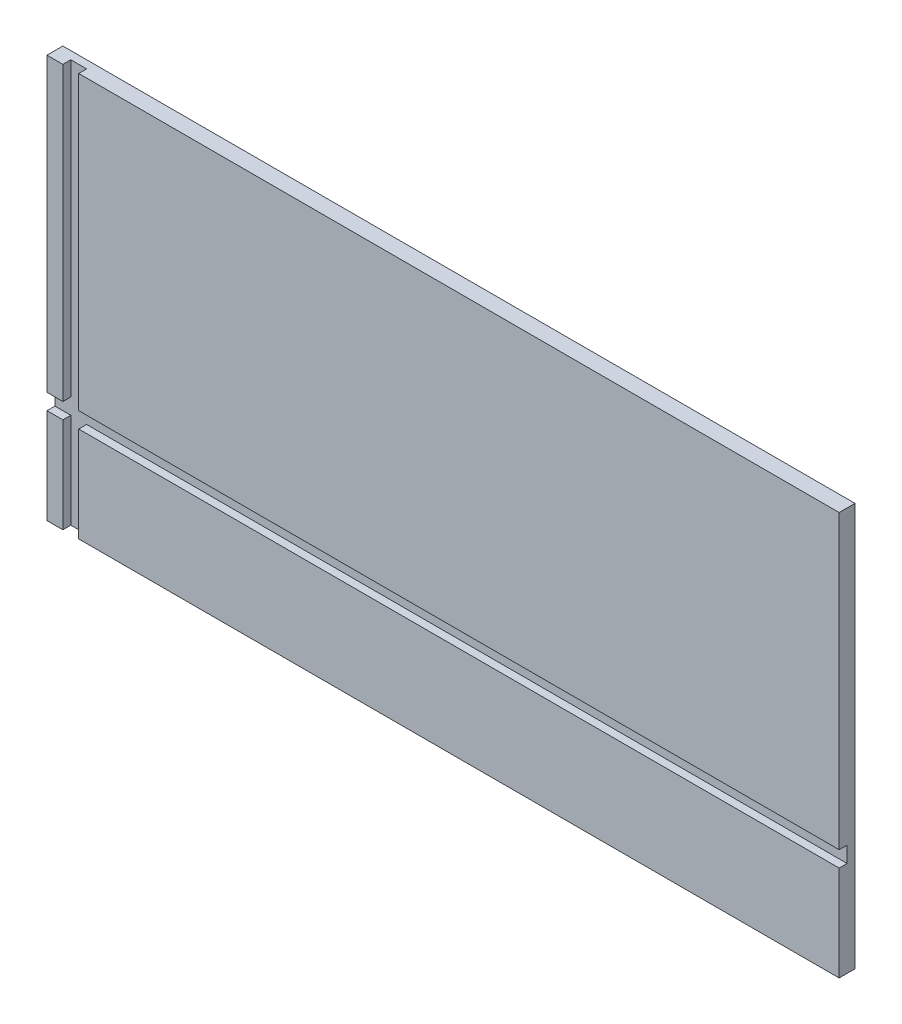
ISO-10303-21;
HEADER;
FILE_DESCRIPTION(('STEP AP214'),'2;1');
FILE_NAME('part.step','',(''),(''),'','','');
FILE_SCHEMA(('AUTOMOTIVE_DESIGN { 1 0 10303 214 1 1 1 1 }'));
ENDSEC;
DATA;
#1=APPLICATION_CONTEXT('core data for automotive mechanical design processes');
#2=APPLICATION_PROTOCOL_DEFINITION('international standard','automotive_design',2000,#1);
#3=PRODUCT_CONTEXT('',#1,'mechanical');
#4=PRODUCT('Part','Part','',(#3));
#5=PRODUCT_RELATED_PRODUCT_CATEGORY('part','',(#4));
#6=PRODUCT_DEFINITION_FORMATION('','',#4);
#7=PRODUCT_DEFINITION_CONTEXT('part definition',#1,'design');
#8=PRODUCT_DEFINITION('design','',#6,#7);
#9=PRODUCT_DEFINITION_SHAPE('','',#8);
#10=(LENGTH_UNIT() NAMED_UNIT(*) SI_UNIT(.MILLI.,.METRE.));
#11=(NAMED_UNIT(*) PLANE_ANGLE_UNIT() SI_UNIT($,.RADIAN.));
#12=(NAMED_UNIT(*) SI_UNIT($,.STERADIAN.) SOLID_ANGLE_UNIT());
#13=UNCERTAINTY_MEASURE_WITH_UNIT(LENGTH_MEASURE(1.E-05),#10,'distance_accuracy_value','');
#14=(GEOMETRIC_REPRESENTATION_CONTEXT(3) GLOBAL_UNCERTAINTY_ASSIGNED_CONTEXT((#13)) GLOBAL_UNIT_ASSIGNED_CONTEXT((#10,
#11,#12)) REPRESENTATION_CONTEXT('',''));
#15=CARTESIAN_POINT('',(0.,0.,0.));
#16=DIRECTION('',(0.,0.,1.));
#17=DIRECTION('',(1.,0.,0.));
#18=AXIS2_PLACEMENT_3D('',#15,#16,#17);
#19=CARTESIAN_POINT('',(0.,0.,3.175));
#20=DIRECTION('',(0.,0.,-1.));
#21=DIRECTION('',(-1.,0.,0.));
#22=AXIS2_PLACEMENT_3D('',#19,#20,#21);
#23=PLANE('',#22);
#24=DIRECTION('',(1.,0.,0.));
#25=VECTOR('',#24,1.);
#26=CARTESIAN_POINT('',(0.,19.05,3.175));
#27=LINE('',#26,#25);
#28=CARTESIAN_POINT('',(-3.17499999999999,19.05,3.175));
#29=VERTEX_POINT('',#28);
#30=CARTESIAN_POINT('',(148.955,19.05,3.175));
#31=VERTEX_POINT('',#30);
#32=EDGE_CURVE('E225',#29,#31,#27,.T.);
#33=ORIENTED_EDGE('',*,*,#32,.F.);
#34=DIRECTION('',(0.,1.,0.));
#35=VECTOR('',#34,1.);
#36=CARTESIAN_POINT('',(-3.17499999999999,0.,3.175));
#37=LINE('',#36,#35);
#38=CARTESIAN_POINT('',(-3.17499999999999,0.,3.175));
#39=VERTEX_POINT('',#38);
#40=EDGE_CURVE('E162',#39,#29,#37,.T.);
#41=ORIENTED_EDGE('',*,*,#40,.F.);
#42=DIRECTION('',(1.,0.,0.));
#43=VECTOR('',#42,1.);
#44=CARTESIAN_POINT('',(89.265,0.,3.175));
#45=LINE('',#44,#43);
#46=CARTESIAN_POINT('',(148.955,0.,3.175));
#47=VERTEX_POINT('',#46);
#48=EDGE_CURVE('E239',#39,#47,#45,.T.);
#49=ORIENTED_EDGE('',*,*,#48,.T.);
#50=DIRECTION('',(0.,1.,0.));
#51=VECTOR('',#50,1.);
#52=CARTESIAN_POINT('',(148.955,80.645,3.175));
#53=LINE('',#52,#51);
#54=EDGE_CURVE('E240',#47,#31,#53,.T.);
#55=ORIENTED_EDGE('',*,*,#54,.T.);
#56=EDGE_LOOP('',(#33,#41,#49,#55));
#57=FACE_BOUND('',#56,.T.);
#58=ADVANCED_FACE('F33',(#57),#23,.F.);
#59=DIRECTION('',(-1.,0.,0.));
#60=VECTOR('',#59,1.);
#61=CARTESIAN_POINT('',(0.,80.645,3.175));
#62=LINE('',#61,#60);
#63=CARTESIAN_POINT('',(148.955,80.645,3.175));
#64=VERTEX_POINT('',#63);
#65=CARTESIAN_POINT('',(-3.17499999999999,80.645,3.175));
#66=VERTEX_POINT('',#65);
#67=EDGE_CURVE('E243',#64,#66,#62,.T.);
#68=ORIENTED_EDGE('',*,*,#67,.T.);
#69=CARTESIAN_POINT('',(-3.17499999999999,22.225,3.175));
#70=VERTEX_POINT('',#69);
#71=EDGE_CURVE('E269',#70,#66,#37,.T.);
#72=ORIENTED_EDGE('',*,*,#71,.F.);
#73=DIRECTION('',(1.,0.,0.));
#74=VECTOR('',#73,1.);
#75=CARTESIAN_POINT('',(0.,22.225,3.175));
#76=LINE('',#75,#74);
#77=CARTESIAN_POINT('',(148.955,22.225,3.175));
#78=VERTEX_POINT('',#77);
#79=EDGE_CURVE('E229',#70,#78,#76,.T.);
#80=ORIENTED_EDGE('',*,*,#79,.T.);
#81=EDGE_CURVE('E238',#78,#64,#53,.T.);
#82=ORIENTED_EDGE('',*,*,#81,.T.);
#83=EDGE_LOOP('',(#68,#72,#80,#82));
#84=FACE_BOUND('',#83,.T.);
#85=ADVANCED_FACE('F300',(#84),#23,.F.);
#86=CARTESIAN_POINT('',(0.,19.05,1.5875));
#87=DIRECTION('',(0.,-1.,0.));
#88=DIRECTION('',(0.,0.,-1.));
#89=AXIS2_PLACEMENT_3D('',#86,#87,#88);
#90=PLANE('',#89);
#91=DIRECTION('',(1.,0.,0.));
#92=VECTOR('',#91,1.);
#93=CARTESIAN_POINT('',(0.,19.05,1.5875));
#94=LINE('',#93,#92);
#95=CARTESIAN_POINT('',(-3.17499999999999,19.05,1.5875));
#96=VERTEX_POINT('',#95);
#97=CARTESIAN_POINT('',(148.955,19.05,1.5875));
#98=VERTEX_POINT('',#97);
#99=EDGE_CURVE('E220',#96,#98,#94,.T.);
#100=ORIENTED_EDGE('',*,*,#99,.F.);
#101=DIRECTION('',(0.,0.,1.));
#102=VECTOR('',#101,1.);
#103=CARTESIAN_POINT('',(-3.17499999999999,19.05,1.5875));
#104=LINE('',#103,#102);
#105=EDGE_CURVE('E184',#96,#29,#104,.T.);
#106=ORIENTED_EDGE('',*,*,#105,.T.);
#107=ORIENTED_EDGE('',*,*,#32,.T.);
#108=DIRECTION('',(0.,0.,-1.));
#109=VECTOR('',#108,1.);
#110=CARTESIAN_POINT('',(148.955,19.05,1.5875));
#111=LINE('',#110,#109);
#112=EDGE_CURVE('E211',#31,#98,#111,.T.);
#113=ORIENTED_EDGE('',*,*,#112,.T.);
#114=EDGE_LOOP('',(#100,#106,#107,#113));
#115=FACE_BOUND('',#114,.T.);
#116=ADVANCED_FACE('F292',(#115),#90,.F.);
#117=CARTESIAN_POINT('',(0.,22.225,3.175));
#118=DIRECTION('',(0.,1.,0.));
#119=DIRECTION('',(0.,0.,1.));
#120=AXIS2_PLACEMENT_3D('',#117,#118,#119);
#121=PLANE('',#120);
#122=ORIENTED_EDGE('',*,*,#79,.F.);
#123=DIRECTION('',(0.,0.,-1.));
#124=VECTOR('',#123,1.);
#125=CARTESIAN_POINT('',(-3.17499999999999,22.225,3.175));
#126=LINE('',#125,#124);
#127=CARTESIAN_POINT('',(-3.17499999999999,22.225,1.5875));
#128=VERTEX_POINT('',#127);
#129=EDGE_CURVE('E181',#70,#128,#126,.T.);
#130=ORIENTED_EDGE('',*,*,#129,.T.);
#131=DIRECTION('',(1.,0.,0.));
#132=VECTOR('',#131,1.);
#133=CARTESIAN_POINT('',(0.,22.225,1.5875));
#134=LINE('',#133,#132);
#135=CARTESIAN_POINT('',(148.955,22.225,1.5875));
#136=VERTEX_POINT('',#135);
#137=EDGE_CURVE('E232',#128,#136,#134,.T.);
#138=ORIENTED_EDGE('',*,*,#137,.T.);
#139=DIRECTION('',(0.,0.,1.));
#140=VECTOR('',#139,1.);
#141=CARTESIAN_POINT('',(148.955,22.225,3.175));
#142=LINE('',#141,#140);
#143=EDGE_CURVE('E217',#136,#78,#142,.T.);
#144=ORIENTED_EDGE('',*,*,#143,.T.);
#145=EDGE_LOOP('',(#122,#130,#138,#144));
#146=FACE_BOUND('',#145,.T.);
#147=ADVANCED_FACE('F295',(#146),#121,.F.);
#148=CARTESIAN_POINT('',(-9.525,0.,3.175));
#149=VERTEX_POINT('',#148);
#150=CARTESIAN_POINT('',(-6.35,0.,3.175));
#151=VERTEX_POINT('',#150);
#152=EDGE_CURVE('E235',#149,#151,#45,.T.);
#153=ORIENTED_EDGE('',*,*,#152,.T.);
#154=DIRECTION('',(0.,-1.,0.));
#155=VECTOR('',#154,1.);
#156=CARTESIAN_POINT('',(-6.35000000000001,80.645,3.175));
#157=LINE('',#156,#155);
#158=CARTESIAN_POINT('',(-6.35,19.05,3.175));
#159=VERTEX_POINT('',#158);
#160=EDGE_CURVE('E270',#159,#151,#157,.T.);
#161=ORIENTED_EDGE('',*,*,#160,.F.);
#162=CARTESIAN_POINT('',(-9.525,19.05,3.175));
#163=VERTEX_POINT('',#162);
#164=EDGE_CURVE('E221',#163,#159,#27,.T.);
#165=ORIENTED_EDGE('',*,*,#164,.F.);
#166=DIRECTION('',(0.,1.,0.));
#167=VECTOR('',#166,1.);
#168=CARTESIAN_POINT('',(-9.525,19.05,3.175));
#169=LINE('',#168,#167);
#170=EDGE_CURVE('E193',#149,#163,#169,.T.);
#171=ORIENTED_EDGE('',*,*,#170,.F.);
#172=EDGE_LOOP('',(#153,#161,#165,#171));
#173=FACE_BOUND('',#172,.T.);
#174=ADVANCED_FACE('F303',(#173),#23,.F.);
#175=CARTESIAN_POINT('',(89.265,0.,3.175));
#176=DIRECTION('',(0.,1.,0.));
#177=DIRECTION('',(0.,0.,1.));
#178=AXIS2_PLACEMENT_3D('',#175,#176,#177);
#179=PLANE('',#178);
#180=ORIENTED_EDGE('',*,*,#48,.F.);
#181=DIRECTION('',(0.,0.,1.));
#182=VECTOR('',#181,1.);
#183=CARTESIAN_POINT('',(-3.17499999999999,0.,1.5875));
#184=LINE('',#183,#182);
#185=CARTESIAN_POINT('',(-3.17499999999999,0.,1.5875));
#186=VERTEX_POINT('',#185);
#187=EDGE_CURVE('E171',#186,#39,#184,.T.);
#188=ORIENTED_EDGE('',*,*,#187,.F.);
#189=DIRECTION('',(1.,0.,0.));
#190=VECTOR('',#189,1.);
#191=CARTESIAN_POINT('',(-6.35,0.,1.5875));
#192=LINE('',#191,#190);
#193=CARTESIAN_POINT('',(-6.35,0.,1.5875));
#194=VERTEX_POINT('',#193);
#195=EDGE_CURVE('E150',#194,#186,#192,.T.);
#196=ORIENTED_EDGE('',*,*,#195,.F.);
#197=DIRECTION('',(0.,0.,1.));
#198=VECTOR('',#197,1.);
#199=CARTESIAN_POINT('',(-6.35,0.,1.5875));
#200=LINE('',#199,#198);
#201=EDGE_CURVE('E168',#194,#151,#200,.T.);
#202=ORIENTED_EDGE('',*,*,#201,.T.);
#203=ORIENTED_EDGE('',*,*,#152,.F.);
#204=DIRECTION('',(0.,0.,1.));
#205=VECTOR('',#204,1.);
#206=CARTESIAN_POINT('',(-9.525,0.,0.));
#207=LINE('',#206,#205);
#208=CARTESIAN_POINT('',(-9.525,0.,0.));
#209=VERTEX_POINT('',#208);
#210=EDGE_CURVE('E190',#209,#149,#207,.T.);
#211=ORIENTED_EDGE('',*,*,#210,.F.);
#212=DIRECTION('',(1.,0.,0.));
#213=VECTOR('',#212,1.);
#214=CARTESIAN_POINT('',(89.265,0.,0.));
#215=LINE('',#214,#213);
#216=CARTESIAN_POINT('',(148.955,0.,0.));
#217=VERTEX_POINT('',#216);
#218=EDGE_CURVE('E224',#209,#217,#215,.T.);
#219=ORIENTED_EDGE('',*,*,#218,.T.);
#220=DIRECTION('',(0.,0.,-1.));
#221=VECTOR('',#220,1.);
#222=CARTESIAN_POINT('',(148.955,0.,3.175));
#223=LINE('',#222,#221);
#224=EDGE_CURVE('E11',#47,#217,#223,.T.);
#225=ORIENTED_EDGE('',*,*,#224,.F.);
#226=EDGE_LOOP('',(#180,#188,#196,#202,#203,#211,#219,#225));
#227=FACE_BOUND('',#226,.T.);
#228=ADVANCED_FACE('F35',(#227),#179,.F.);
#229=CARTESIAN_POINT('',(148.955,80.645,3.175));
#230=DIRECTION('',(-1.,0.,0.));
#231=DIRECTION('',(0.,0.,1.));
#232=AXIS2_PLACEMENT_3D('',#229,#230,#231);
#233=PLANE('',#232);
#234=DIRECTION('',(0.,1.,0.));
#235=VECTOR('',#234,1.);
#236=CARTESIAN_POINT('',(148.955,22.225,1.5875));
#237=LINE('',#236,#235);
#238=EDGE_CURVE('E214',#98,#136,#237,.T.);
#239=ORIENTED_EDGE('',*,*,#238,.F.);
#240=ORIENTED_EDGE('',*,*,#112,.F.);
#241=ORIENTED_EDGE('',*,*,#54,.F.);
#242=ORIENTED_EDGE('',*,*,#224,.T.);
#243=DIRECTION('',(0.,1.,0.));
#244=VECTOR('',#243,1.);
#245=CARTESIAN_POINT('',(148.955,80.645,0.));
#246=LINE('',#245,#244);
#247=CARTESIAN_POINT('',(148.955,80.645,0.));
#248=VERTEX_POINT('',#247);
#249=EDGE_CURVE('E247',#217,#248,#246,.T.);
#250=ORIENTED_EDGE('',*,*,#249,.T.);
#251=DIRECTION('',(0.,0.,-1.));
#252=VECTOR('',#251,1.);
#253=CARTESIAN_POINT('',(148.955,80.645,3.175));
#254=LINE('',#253,#252);
#255=EDGE_CURVE('E41',#64,#248,#254,.T.);
#256=ORIENTED_EDGE('',*,*,#255,.F.);
#257=ORIENTED_EDGE('',*,*,#81,.F.);
#258=ORIENTED_EDGE('',*,*,#143,.F.);
#259=EDGE_LOOP('',(#239,#240,#241,#242,#250,#256,#257,#258));
#260=FACE_BOUND('',#259,.T.);
#261=ADVANCED_FACE('F288',(#260),#233,.F.);
#262=CARTESIAN_POINT('',(0.,80.645,3.175));
#263=DIRECTION('',(0.,-1.,0.));
#264=DIRECTION('',(0.,0.,-1.));
#265=AXIS2_PLACEMENT_3D('',#262,#263,#264);
#266=PLANE('',#265);
#267=DIRECTION('',(-1.,0.,0.));
#268=VECTOR('',#267,1.);
#269=CARTESIAN_POINT('',(-3.17499999999999,80.645,1.5875));
#270=LINE('',#269,#268);
#271=CARTESIAN_POINT('',(-3.17499999999999,80.645,1.5875));
#272=VERTEX_POINT('',#271);
#273=CARTESIAN_POINT('',(-6.35000000000001,80.645,1.5875));
#274=VERTEX_POINT('',#273);
#275=EDGE_CURVE('E154',#272,#274,#270,.T.);
#276=ORIENTED_EDGE('',*,*,#275,.F.);
#277=DIRECTION('',(0.,0.,1.));
#278=VECTOR('',#277,1.);
#279=CARTESIAN_POINT('',(-3.17499999999999,80.645,1.5875));
#280=LINE('',#279,#278);
#281=EDGE_CURVE('E178',#272,#66,#280,.T.);
#282=ORIENTED_EDGE('',*,*,#281,.T.);
#283=ORIENTED_EDGE('',*,*,#67,.F.);
#284=ORIENTED_EDGE('',*,*,#255,.T.);
#285=DIRECTION('',(-1.,0.,0.));
#286=VECTOR('',#285,1.);
#287=CARTESIAN_POINT('',(0.,80.645,0.));
#288=LINE('',#287,#286);
#289=CARTESIAN_POINT('',(-9.525,80.645,0.));
#290=VERTEX_POINT('',#289);
#291=EDGE_CURVE('E249',#248,#290,#288,.T.);
#292=ORIENTED_EDGE('',*,*,#291,.T.);
#293=DIRECTION('',(0.,0.,-1.));
#294=VECTOR('',#293,1.);
#295=CARTESIAN_POINT('',(-9.525,80.645,0.));
#296=LINE('',#295,#294);
#297=CARTESIAN_POINT('',(-9.525,80.645,3.175));
#298=VERTEX_POINT('',#297);
#299=EDGE_CURVE('E208',#298,#290,#296,.T.);
#300=ORIENTED_EDGE('',*,*,#299,.F.);
#301=CARTESIAN_POINT('',(-6.35000000000001,80.645,3.175));
#302=VERTEX_POINT('',#301);
#303=EDGE_CURVE('E167',#302,#298,#62,.T.);
#304=ORIENTED_EDGE('',*,*,#303,.F.);
#305=DIRECTION('',(0.,0.,1.));
#306=VECTOR('',#305,1.);
#307=CARTESIAN_POINT('',(-6.35000000000001,80.645,1.5875));
#308=LINE('',#307,#306);
#309=EDGE_CURVE('E145',#274,#302,#308,.T.);
#310=ORIENTED_EDGE('',*,*,#309,.F.);
#311=EDGE_LOOP('',(#276,#282,#283,#284,#292,#300,#304,#310));
#312=FACE_BOUND('',#311,.T.);
#313=ADVANCED_FACE('F165',(#312),#266,.F.);
#314=CARTESIAN_POINT('',(-9.525,22.225,3.175));
#315=VERTEX_POINT('',#314);
#316=CARTESIAN_POINT('',(-6.35,22.225,3.175));
#317=VERTEX_POINT('',#316);
#318=EDGE_CURVE('E226',#315,#317,#76,.T.);
#319=ORIENTED_EDGE('',*,*,#318,.T.);
#320=EDGE_CURVE('E268',#302,#317,#157,.T.);
#321=ORIENTED_EDGE('',*,*,#320,.F.);
#322=ORIENTED_EDGE('',*,*,#303,.T.);
#323=DIRECTION('',(0.,1.,0.));
#324=VECTOR('',#323,1.);
#325=CARTESIAN_POINT('',(-9.525,80.645,3.175));
#326=LINE('',#325,#324);
#327=EDGE_CURVE('E205',#315,#298,#326,.T.);
#328=ORIENTED_EDGE('',*,*,#327,.F.);
#329=EDGE_LOOP('',(#319,#321,#322,#328));
#330=FACE_BOUND('',#329,.T.);
#331=ADVANCED_FACE('F267',(#330),#23,.F.);
#332=CARTESIAN_POINT('',(0.,0.,0.));
#333=DIRECTION('',(0.,0.,-1.));
#334=DIRECTION('',(-1.,0.,0.));
#335=AXIS2_PLACEMENT_3D('',#332,#333,#334);
#336=PLANE('',#335);
#337=ORIENTED_EDGE('',*,*,#218,.F.);
#338=DIRECTION('',(0.,-1.,0.));
#339=VECTOR('',#338,1.);
#340=CARTESIAN_POINT('',(-9.525,80.645,0.));
#341=LINE('',#340,#339);
#342=EDGE_CURVE('E187',#290,#209,#341,.T.);
#343=ORIENTED_EDGE('',*,*,#342,.F.);
#344=ORIENTED_EDGE('',*,*,#291,.F.);
#345=ORIENTED_EDGE('',*,*,#249,.F.);
#346=EDGE_LOOP('',(#337,#343,#344,#345));
#347=FACE_BOUND('',#346,.T.);
#348=ADVANCED_FACE('F259',(#347),#336,.T.);
#349=ORIENTED_EDGE('',*,*,#164,.T.);
#350=DIRECTION('',(0.,0.,-1.));
#351=VECTOR('',#350,1.);
#352=CARTESIAN_POINT('',(-6.35,19.05,1.5875));
#353=LINE('',#352,#351);
#354=CARTESIAN_POINT('',(-6.35,19.05,1.5875));
#355=VERTEX_POINT('',#354);
#356=EDGE_CURVE('E177',#159,#355,#353,.T.);
#357=ORIENTED_EDGE('',*,*,#356,.T.);
#358=CARTESIAN_POINT('',(-9.525,19.05,1.5875));
#359=VERTEX_POINT('',#358);
#360=EDGE_CURVE('E233',#359,#355,#94,.T.);
#361=ORIENTED_EDGE('',*,*,#360,.F.);
#362=DIRECTION('',(0.,0.,-1.));
#363=VECTOR('',#362,1.);
#364=CARTESIAN_POINT('',(-9.525,19.05,1.5875));
#365=LINE('',#364,#363);
#366=EDGE_CURVE('E196',#163,#359,#365,.T.);
#367=ORIENTED_EDGE('',*,*,#366,.F.);
#368=EDGE_LOOP('',(#349,#357,#361,#367));
#369=FACE_BOUND('',#368,.T.);
#370=ADVANCED_FACE('F309',(#369),#90,.F.);
#371=CARTESIAN_POINT('',(-9.525,22.225,1.5875));
#372=VERTEX_POINT('',#371);
#373=CARTESIAN_POINT('',(-6.35,22.225,1.5875));
#374=VERTEX_POINT('',#373);
#375=EDGE_CURVE('E230',#372,#374,#134,.T.);
#376=ORIENTED_EDGE('',*,*,#375,.T.);
#377=DIRECTION('',(0.,0.,1.));
#378=VECTOR('',#377,1.);
#379=CARTESIAN_POINT('',(-6.35,22.225,3.175));
#380=LINE('',#379,#378);
#381=EDGE_CURVE('E148',#374,#317,#380,.T.);
#382=ORIENTED_EDGE('',*,*,#381,.T.);
#383=ORIENTED_EDGE('',*,*,#318,.F.);
#384=DIRECTION('',(0.,0.,1.));
#385=VECTOR('',#384,1.);
#386=CARTESIAN_POINT('',(-9.525,22.225,1.5875));
#387=LINE('',#386,#385);
#388=EDGE_CURVE('E202',#372,#315,#387,.T.);
#389=ORIENTED_EDGE('',*,*,#388,.F.);
#390=EDGE_LOOP('',(#376,#382,#383,#389));
#391=FACE_BOUND('',#390,.T.);
#392=ADVANCED_FACE('F318',(#391),#121,.F.);
#393=CARTESIAN_POINT('',(0.,22.225,1.5875));
#394=DIRECTION('',(0.,0.,-1.));
#395=DIRECTION('',(-1.,0.,0.));
#396=AXIS2_PLACEMENT_3D('',#393,#394,#395);
#397=PLANE('',#396);
#398=ORIENTED_EDGE('',*,*,#360,.T.);
#399=DIRECTION('',(0.,-1.,0.));
#400=VECTOR('',#399,1.);
#401=CARTESIAN_POINT('',(-6.35000000000001,80.645,1.5875));
#402=LINE('',#401,#400);
#403=EDGE_CURVE('E151',#355,#194,#402,.T.);
#404=ORIENTED_EDGE('',*,*,#403,.T.);
#405=ORIENTED_EDGE('',*,*,#195,.T.);
#406=DIRECTION('',(0.,1.,0.));
#407=VECTOR('',#406,1.);
#408=CARTESIAN_POINT('',(-3.17499999999999,0.,1.5875));
#409=LINE('',#408,#407);
#410=EDGE_CURVE('E48',#186,#96,#409,.T.);
#411=ORIENTED_EDGE('',*,*,#410,.T.);
#412=ORIENTED_EDGE('',*,*,#99,.T.);
#413=ORIENTED_EDGE('',*,*,#238,.T.);
#414=ORIENTED_EDGE('',*,*,#137,.F.);
#415=EDGE_CURVE('E158',#128,#272,#409,.T.);
#416=ORIENTED_EDGE('',*,*,#415,.T.);
#417=ORIENTED_EDGE('',*,*,#275,.T.);
#418=EDGE_CURVE('E55',#274,#374,#402,.T.);
#419=ORIENTED_EDGE('',*,*,#418,.T.);
#420=ORIENTED_EDGE('',*,*,#375,.F.);
#421=DIRECTION('',(0.,1.,0.));
#422=VECTOR('',#421,1.);
#423=CARTESIAN_POINT('',(-9.525,19.05,1.5875));
#424=LINE('',#423,#422);
#425=EDGE_CURVE('E199',#359,#372,#424,.T.);
#426=ORIENTED_EDGE('',*,*,#425,.F.);
#427=EDGE_LOOP('',(#398,#404,#405,#411,#412,#413,#414,#416,#417,#419,#420,#426));
#428=FACE_BOUND('',#427,.T.);
#429=ADVANCED_FACE('F156',(#428),#397,.F.);
#430=CARTESIAN_POINT('',(-9.525,0.,0.));
#431=DIRECTION('',(-1.,0.,0.));
#432=DIRECTION('',(0.,0.,1.));
#433=AXIS2_PLACEMENT_3D('',#430,#431,#432);
#434=PLANE('',#433);
#435=ORIENTED_EDGE('',*,*,#342,.T.);
#436=ORIENTED_EDGE('',*,*,#210,.T.);
#437=ORIENTED_EDGE('',*,*,#170,.T.);
#438=ORIENTED_EDGE('',*,*,#366,.T.);
#439=ORIENTED_EDGE('',*,*,#425,.T.);
#440=ORIENTED_EDGE('',*,*,#388,.T.);
#441=ORIENTED_EDGE('',*,*,#327,.T.);
#442=ORIENTED_EDGE('',*,*,#299,.T.);
#443=EDGE_LOOP('',(#435,#436,#437,#438,#439,#440,#441,#442));
#444=FACE_BOUND('',#443,.T.);
#445=ADVANCED_FACE('F262',(#444),#434,.T.);
#446=CARTESIAN_POINT('',(-6.35000000000001,80.645,1.5875));
#447=DIRECTION('',(-1.,0.,0.));
#448=DIRECTION('',(0.,-1.,0.));
#449=AXIS2_PLACEMENT_3D('',#446,#447,#448);
#450=PLANE('',#449);
#451=ORIENTED_EDGE('',*,*,#418,.F.);
#452=ORIENTED_EDGE('',*,*,#309,.T.);
#453=ORIENTED_EDGE('',*,*,#320,.T.);
#454=ORIENTED_EDGE('',*,*,#381,.F.);
#455=EDGE_LOOP('',(#451,#452,#453,#454));
#456=FACE_BOUND('',#455,.T.);
#457=ADVANCED_FACE('F143',(#456),#450,.F.);
#458=CARTESIAN_POINT('',(-3.17499999999999,0.,1.5875));
#459=DIRECTION('',(1.,0.,0.));
#460=DIRECTION('',(0.,0.,-1.));
#461=AXIS2_PLACEMENT_3D('',#458,#459,#460);
#462=PLANE('',#461);
#463=ORIENTED_EDGE('',*,*,#71,.T.);
#464=ORIENTED_EDGE('',*,*,#281,.F.);
#465=ORIENTED_EDGE('',*,*,#415,.F.);
#466=ORIENTED_EDGE('',*,*,#129,.F.);
#467=EDGE_LOOP('',(#463,#464,#465,#466));
#468=FACE_BOUND('',#467,.T.);
#469=ADVANCED_FACE('F298',(#468),#462,.F.);
#470=ORIENTED_EDGE('',*,*,#410,.F.);
#471=ORIENTED_EDGE('',*,*,#187,.T.);
#472=ORIENTED_EDGE('',*,*,#40,.T.);
#473=ORIENTED_EDGE('',*,*,#105,.F.);
#474=EDGE_LOOP('',(#470,#471,#472,#473));
#475=FACE_BOUND('',#474,.T.);
#476=ADVANCED_FACE('F278',(#475),#462,.F.);
#477=ORIENTED_EDGE('',*,*,#160,.T.);
#478=ORIENTED_EDGE('',*,*,#201,.F.);
#479=ORIENTED_EDGE('',*,*,#403,.F.);
#480=ORIENTED_EDGE('',*,*,#356,.F.);
#481=EDGE_LOOP('',(#477,#478,#479,#480));
#482=FACE_BOUND('',#481,.T.);
#483=ADVANCED_FACE('F420',(#482),#450,.F.);
#484=CLOSED_SHELL('',(#58,#85,#116,#147,#174,#228,#261,#313,#331,#348,#370,#392,#429,#445,#457,
#469,#476,#483));
#485=MANIFOLD_SOLID_BREP('B2',#484);
#486=ADVANCED_BREP_SHAPE_REPRESENTATION('',(#18,#485),#14);
#487=SHAPE_DEFINITION_REPRESENTATION(#9,#486);
ENDSEC;
END-ISO-10303-21;
